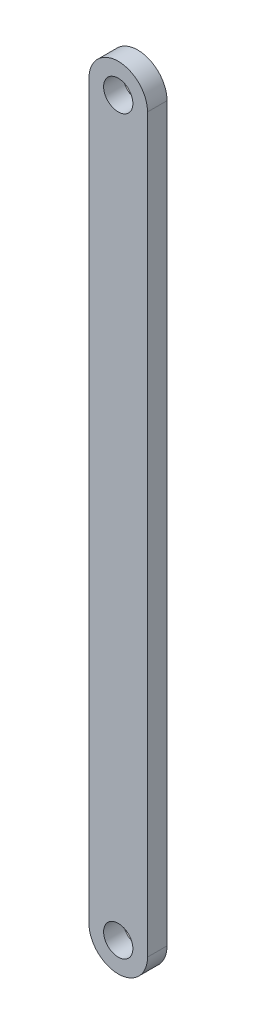
ISO-10303-21;
HEADER;
FILE_DESCRIPTION(('STEP AP214'),'2;1');
FILE_NAME('part.step','',(''),(''),'','','');
FILE_SCHEMA(('AUTOMOTIVE_DESIGN { 1 0 10303 214 1 1 1 1 }'));
ENDSEC;
DATA;
#1=APPLICATION_CONTEXT('core data for automotive mechanical design processes');
#2=APPLICATION_PROTOCOL_DEFINITION('international standard','automotive_design',2000,#1);
#3=PRODUCT_CONTEXT('',#1,'mechanical');
#4=PRODUCT('Part','Part','',(#3));
#5=PRODUCT_RELATED_PRODUCT_CATEGORY('part','',(#4));
#6=PRODUCT_DEFINITION_FORMATION('','',#4);
#7=PRODUCT_DEFINITION_CONTEXT('part definition',#1,'design');
#8=PRODUCT_DEFINITION('design','',#6,#7);
#9=PRODUCT_DEFINITION_SHAPE('','',#8);
#10=(LENGTH_UNIT() NAMED_UNIT(*) SI_UNIT(.MILLI.,.METRE.));
#11=(NAMED_UNIT(*) PLANE_ANGLE_UNIT() SI_UNIT($,.RADIAN.));
#12=(NAMED_UNIT(*) SI_UNIT($,.STERADIAN.) SOLID_ANGLE_UNIT());
#13=UNCERTAINTY_MEASURE_WITH_UNIT(LENGTH_MEASURE(1.E-05),#10,'distance_accuracy_value','');
#14=(GEOMETRIC_REPRESENTATION_CONTEXT(3) GLOBAL_UNCERTAINTY_ASSIGNED_CONTEXT((#13)) GLOBAL_UNIT_ASSIGNED_CONTEXT((#10,
#11,#12)) REPRESENTATION_CONTEXT('',''));
#15=CARTESIAN_POINT('',(0.,0.,0.));
#16=DIRECTION('',(0.,0.,1.));
#17=DIRECTION('',(1.,0.,0.));
#18=AXIS2_PLACEMENT_3D('',#15,#16,#17);
#19=CARTESIAN_POINT('',(-3.,-75.,0.));
#20=DIRECTION('',(1.,0.,0.));
#21=DIRECTION('',(0.,1.,0.));
#22=AXIS2_PLACEMENT_3D('',#19,#20,#21);
#23=PLANE('',#22);
#24=DIRECTION('',(0.,0.,-1.));
#25=VECTOR('',#24,1.);
#26=CARTESIAN_POINT('',(-3.,-75.0000000005388,1.));
#27=LINE('',#26,#25);
#28=CARTESIAN_POINT('',(-3.,-75.0000000002694,0.));
#29=VERTEX_POINT('',#28);
#30=CARTESIAN_POINT('',(-3.,-75.0000000002694,2.));
#31=VERTEX_POINT('',#30);
#32=EDGE_CURVE('E71',#29,#31,#27,.F.);
#33=ORIENTED_EDGE('',*,*,#32,.T.);
#34=DIRECTION('',(0.,-1.,0.));
#35=VECTOR('',#34,1.);
#36=CARTESIAN_POINT('',(-3.,-37.5,2.));
#37=LINE('',#36,#35);
#38=CARTESIAN_POINT('',(-3.,0.,2.));
#39=VERTEX_POINT('',#38);
#40=EDGE_CURVE('E68',#39,#31,#37,.T.);
#41=ORIENTED_EDGE('',*,*,#40,.F.);
#42=DIRECTION('',(0.,0.,1.));
#43=VECTOR('',#42,1.);
#44=CARTESIAN_POINT('',(-3.,0.,1.));
#45=LINE('',#44,#43);
#46=CARTESIAN_POINT('',(-3.,0.,0.));
#47=VERTEX_POINT('',#46);
#48=EDGE_CURVE('E58',#39,#47,#45,.F.);
#49=ORIENTED_EDGE('',*,*,#48,.T.);
#50=DIRECTION('',(0.,-1.,0.));
#51=VECTOR('',#50,1.);
#52=CARTESIAN_POINT('',(-3.,-37.5,0.));
#53=LINE('',#52,#51);
#54=EDGE_CURVE('E93',#47,#29,#53,.T.);
#55=ORIENTED_EDGE('',*,*,#54,.T.);
#56=EDGE_LOOP('',(#33,#41,#49,#55));
#57=FACE_BOUND('',#56,.T.);
#58=ADVANCED_FACE('F16',(#57),#23,.F.);
#59=CARTESIAN_POINT('',(0.,-75.,2.));
#60=DIRECTION('',(0.,0.,-1.));
#61=DIRECTION('',(-1.,0.,0.));
#62=AXIS2_PLACEMENT_3D('',#59,#60,#61);
#63=CYLINDRICAL_SURFACE('',#62,3.);
#64=DIRECTION('',(0.,0.,1.));
#65=VECTOR('',#64,1.);
#66=CARTESIAN_POINT('',(3.,-75.,1.));
#67=LINE('',#66,#65);
#68=CARTESIAN_POINT('',(3.,-75.,0.));
#69=VERTEX_POINT('',#68);
#70=CARTESIAN_POINT('',(3.,-75.,2.));
#71=VERTEX_POINT('',#70);
#72=EDGE_CURVE('E79',#69,#71,#67,.T.);
#73=ORIENTED_EDGE('',*,*,#72,.T.);
#74=CARTESIAN_POINT('',(0.,-75.,2.));
#75=DIRECTION('',(0.,0.,-1.));
#76=DIRECTION('',(-1.,0.,0.));
#77=AXIS2_PLACEMENT_3D('',#74,#75,#76);
#78=CIRCLE('',#77,3.);
#79=EDGE_CURVE('E73',#31,#71,#78,.F.);
#80=ORIENTED_EDGE('',*,*,#79,.F.);
#81=ORIENTED_EDGE('',*,*,#32,.F.);
#82=CARTESIAN_POINT('',(0.,-75.,0.));
#83=DIRECTION('',(0.,0.,-1.));
#84=DIRECTION('',(-1.,0.,0.));
#85=AXIS2_PLACEMENT_3D('',#82,#83,#84);
#86=CIRCLE('',#85,3.);
#87=EDGE_CURVE('E90',#29,#69,#86,.F.);
#88=ORIENTED_EDGE('',*,*,#87,.T.);
#89=EDGE_LOOP('',(#73,#80,#81,#88));
#90=FACE_BOUND('',#89,.T.);
#91=ADVANCED_FACE('F104',(#90),#63,.T.);
#92=CARTESIAN_POINT('',(3.,0.,0.));
#93=DIRECTION('',(-1.,0.,0.));
#94=DIRECTION('',(0.,-1.,0.));
#95=AXIS2_PLACEMENT_3D('',#92,#93,#94);
#96=PLANE('',#95);
#97=DIRECTION('',(0.,0.,-1.));
#98=VECTOR('',#97,1.);
#99=CARTESIAN_POINT('',(3.,-1.23062057109199E-09,1.));
#100=LINE('',#99,#98);
#101=CARTESIAN_POINT('',(3.,-6.15310285545994E-10,0.));
#102=VERTEX_POINT('',#101);
#103=CARTESIAN_POINT('',(3.,-6.15310285545994E-10,2.));
#104=VERTEX_POINT('',#103);
#105=EDGE_CURVE('E35',#102,#104,#100,.F.);
#106=ORIENTED_EDGE('',*,*,#105,.T.);
#107=DIRECTION('',(0.,1.,0.));
#108=VECTOR('',#107,1.);
#109=CARTESIAN_POINT('',(3.,-37.5,2.));
#110=LINE('',#109,#108);
#111=EDGE_CURVE('E70',#71,#104,#110,.T.);
#112=ORIENTED_EDGE('',*,*,#111,.F.);
#113=ORIENTED_EDGE('',*,*,#72,.F.);
#114=DIRECTION('',(0.,1.,0.));
#115=VECTOR('',#114,1.);
#116=CARTESIAN_POINT('',(3.,-37.5,0.));
#117=LINE('',#116,#115);
#118=EDGE_CURVE('E89',#69,#102,#117,.T.);
#119=ORIENTED_EDGE('',*,*,#118,.T.);
#120=EDGE_LOOP('',(#106,#112,#113,#119));
#121=FACE_BOUND('',#120,.T.);
#122=ADVANCED_FACE('F100',(#121),#96,.F.);
#123=CARTESIAN_POINT('',(0.,0.,2.));
#124=DIRECTION('',(0.,0.,-1.));
#125=DIRECTION('',(-1.,0.,0.));
#126=AXIS2_PLACEMENT_3D('',#123,#124,#125);
#127=CYLINDRICAL_SURFACE('',#126,3.);
#128=ORIENTED_EDGE('',*,*,#48,.F.);
#129=CARTESIAN_POINT('',(0.,0.,2.));
#130=DIRECTION('',(0.,0.,-1.));
#131=DIRECTION('',(-1.,0.,0.));
#132=AXIS2_PLACEMENT_3D('',#129,#130,#131);
#133=CIRCLE('',#132,3.);
#134=EDGE_CURVE('E20',#104,#39,#133,.F.);
#135=ORIENTED_EDGE('',*,*,#134,.F.);
#136=ORIENTED_EDGE('',*,*,#105,.F.);
#137=CARTESIAN_POINT('',(0.,0.,0.));
#138=DIRECTION('',(0.,0.,-1.));
#139=DIRECTION('',(-1.,0.,0.));
#140=AXIS2_PLACEMENT_3D('',#137,#138,#139);
#141=CIRCLE('',#140,3.);
#142=EDGE_CURVE('E61',#102,#47,#141,.F.);
#143=ORIENTED_EDGE('',*,*,#142,.T.);
#144=EDGE_LOOP('',(#128,#135,#136,#143));
#145=FACE_BOUND('',#144,.T.);
#146=ADVANCED_FACE('F60',(#145),#127,.T.);
#147=CARTESIAN_POINT('',(0.,0.,2.));
#148=DIRECTION('',(0.,0.,-1.));
#149=DIRECTION('',(-1.,0.,0.));
#150=AXIS2_PLACEMENT_3D('',#147,#148,#149);
#151=CYLINDRICAL_SURFACE('',#150,1.5);
#152=CARTESIAN_POINT('',(0.,0.,0.));
#153=DIRECTION('',(0.,0.,-1.));
#154=DIRECTION('',(-1.,0.,0.));
#155=AXIS2_PLACEMENT_3D('',#152,#153,#154);
#156=CIRCLE('',#155,1.5);
#157=CARTESIAN_POINT('',(-1.5,0.,0.));
#158=VERTEX_POINT('',#157);
#159=EDGE_CURVE('E85',#158,#158,#156,.T.);
#160=ORIENTED_EDGE('',*,*,#159,.T.);
#161=EDGE_LOOP('',(#160));
#162=FACE_BOUND('',#161,.T.);
#163=CARTESIAN_POINT('',(0.,0.,2.));
#164=DIRECTION('',(0.,0.,-1.));
#165=DIRECTION('',(-1.,0.,0.));
#166=AXIS2_PLACEMENT_3D('',#163,#164,#165);
#167=CIRCLE('',#166,1.5);
#168=CARTESIAN_POINT('',(-1.5,0.,2.));
#169=VERTEX_POINT('',#168);
#170=EDGE_CURVE('E94',#169,#169,#167,.T.);
#171=ORIENTED_EDGE('',*,*,#170,.F.);
#172=EDGE_LOOP('',(#171));
#173=FACE_BOUND('',#172,.T.);
#174=ADVANCED_FACE('F125',(#162,#173),#151,.F.);
#175=CARTESIAN_POINT('',(-3.,-78.486,2.));
#176=DIRECTION('',(0.,0.,1.));
#177=DIRECTION('',(1.,0.,0.));
#178=AXIS2_PLACEMENT_3D('',#175,#176,#177);
#179=PLANE('',#178);
#180=CARTESIAN_POINT('',(0.,-75.,2.));
#181=DIRECTION('',(0.,0.,-1.));
#182=DIRECTION('',(-1.,0.,0.));
#183=AXIS2_PLACEMENT_3D('',#180,#181,#182);
#184=CIRCLE('',#183,1.5);
#185=CARTESIAN_POINT('',(-1.5,-75.,2.));
#186=VERTEX_POINT('',#185);
#187=EDGE_CURVE('E26',#186,#186,#184,.F.);
#188=ORIENTED_EDGE('',*,*,#187,.F.);
#189=EDGE_LOOP('',(#188));
#190=FACE_BOUND('',#189,.T.);
#191=ORIENTED_EDGE('',*,*,#170,.T.);
#192=EDGE_LOOP('',(#191));
#193=FACE_BOUND('',#192,.T.);
#194=ORIENTED_EDGE('',*,*,#79,.T.);
#195=ORIENTED_EDGE('',*,*,#111,.T.);
#196=ORIENTED_EDGE('',*,*,#134,.T.);
#197=ORIENTED_EDGE('',*,*,#40,.T.);
#198=EDGE_LOOP('',(#194,#195,#196,#197));
#199=FACE_BOUND('',#198,.T.);
#200=ADVANCED_FACE('F67',(#190,#193,#199),#179,.T.);
#201=CARTESIAN_POINT('',(-3.,-78.486,0.));
#202=DIRECTION('',(0.,0.,1.));
#203=DIRECTION('',(1.,0.,0.));
#204=AXIS2_PLACEMENT_3D('',#201,#202,#203);
#205=PLANE('',#204);
#206=CARTESIAN_POINT('',(0.,-75.,0.));
#207=DIRECTION('',(0.,0.,-1.));
#208=DIRECTION('',(-1.,0.,0.));
#209=AXIS2_PLACEMENT_3D('',#206,#207,#208);
#210=CIRCLE('',#209,1.5);
#211=CARTESIAN_POINT('',(-1.5,-75.,0.));
#212=VERTEX_POINT('',#211);
#213=EDGE_CURVE('E10',#212,#212,#210,.T.);
#214=ORIENTED_EDGE('',*,*,#213,.F.);
#215=EDGE_LOOP('',(#214));
#216=FACE_BOUND('',#215,.T.);
#217=ORIENTED_EDGE('',*,*,#159,.F.);
#218=EDGE_LOOP('',(#217));
#219=FACE_BOUND('',#218,.T.);
#220=ORIENTED_EDGE('',*,*,#118,.F.);
#221=ORIENTED_EDGE('',*,*,#87,.F.);
#222=ORIENTED_EDGE('',*,*,#54,.F.);
#223=ORIENTED_EDGE('',*,*,#142,.F.);
#224=EDGE_LOOP('',(#220,#221,#222,#223));
#225=FACE_BOUND('',#224,.T.);
#226=ADVANCED_FACE('F18',(#216,#219,#225),#205,.F.);
#227=CARTESIAN_POINT('',(0.,-75.,2.));
#228=DIRECTION('',(0.,0.,-1.));
#229=DIRECTION('',(-1.,0.,0.));
#230=AXIS2_PLACEMENT_3D('',#227,#228,#229);
#231=CYLINDRICAL_SURFACE('',#230,1.5);
#232=ORIENTED_EDGE('',*,*,#213,.T.);
#233=EDGE_LOOP('',(#232));
#234=FACE_BOUND('',#233,.T.);
#235=ORIENTED_EDGE('',*,*,#187,.T.);
#236=EDGE_LOOP('',(#235));
#237=FACE_BOUND('',#236,.T.);
#238=ADVANCED_FACE('F115',(#234,#237),#231,.F.);
#239=CLOSED_SHELL('',(#58,#91,#122,#146,#174,#200,#226,#238));
#240=MANIFOLD_SOLID_BREP('B1',#239);
#241=ADVANCED_BREP_SHAPE_REPRESENTATION('',(#18,#240),#14);
#242=SHAPE_DEFINITION_REPRESENTATION(#9,#241);
ENDSEC;
END-ISO-10303-21;
